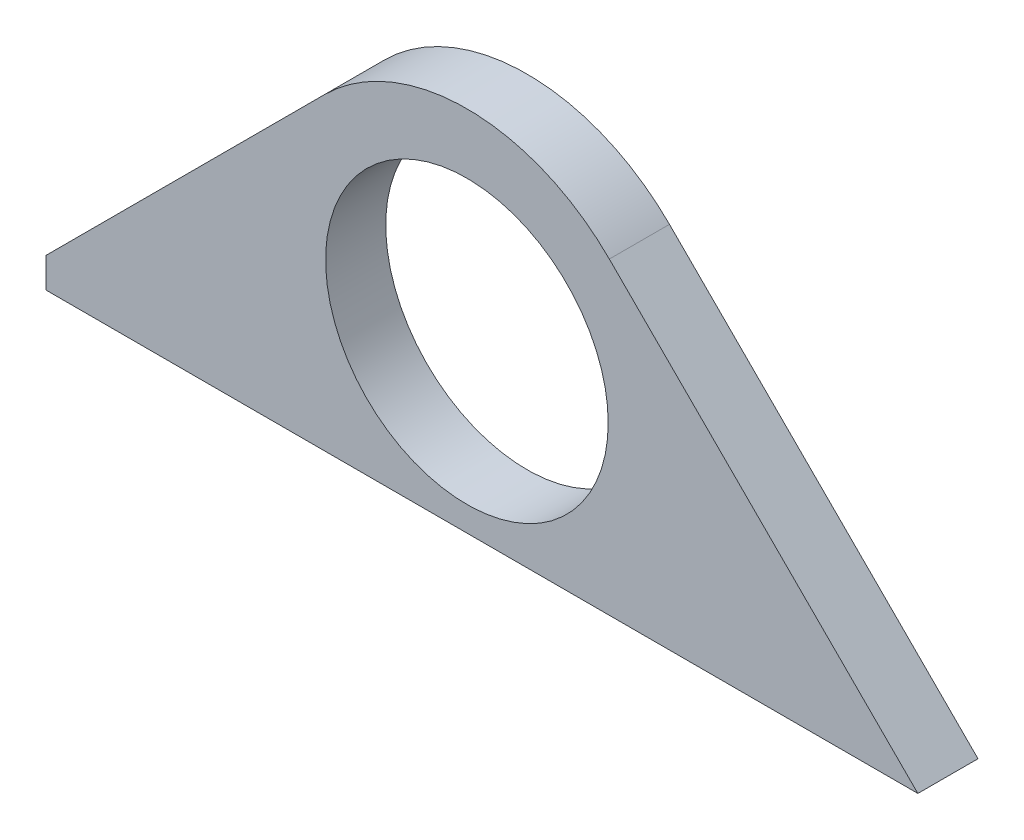
ISO-10303-21;
HEADER;
FILE_DESCRIPTION(('STEP AP214'),'2;1');
FILE_NAME('part.step','',(''),(''),'','','');
FILE_SCHEMA(('AUTOMOTIVE_DESIGN { 1 0 10303 214 1 1 1 1 }'));
ENDSEC;
DATA;
#1=APPLICATION_CONTEXT('core data for automotive mechanical design processes');
#2=APPLICATION_PROTOCOL_DEFINITION('international standard','automotive_design',2000,#1);
#3=PRODUCT_CONTEXT('',#1,'mechanical');
#4=PRODUCT('Part','Part','',(#3));
#5=PRODUCT_RELATED_PRODUCT_CATEGORY('part','',(#4));
#6=PRODUCT_DEFINITION_FORMATION('','',#4);
#7=PRODUCT_DEFINITION_CONTEXT('part definition',#1,'design');
#8=PRODUCT_DEFINITION('design','',#6,#7);
#9=PRODUCT_DEFINITION_SHAPE('','',#8);
#10=(LENGTH_UNIT() NAMED_UNIT(*) SI_UNIT(.MILLI.,.METRE.));
#11=(NAMED_UNIT(*) PLANE_ANGLE_UNIT() SI_UNIT($,.RADIAN.));
#12=(NAMED_UNIT(*) SI_UNIT($,.STERADIAN.) SOLID_ANGLE_UNIT());
#13=UNCERTAINTY_MEASURE_WITH_UNIT(LENGTH_MEASURE(1.E-05),#10,'distance_accuracy_value','');
#14=(GEOMETRIC_REPRESENTATION_CONTEXT(3) GLOBAL_UNCERTAINTY_ASSIGNED_CONTEXT((#13)) GLOBAL_UNIT_ASSIGNED_CONTEXT((#10,
#11,#12)) REPRESENTATION_CONTEXT('',''));
#15=CARTESIAN_POINT('',(0.,0.,0.));
#16=DIRECTION('',(0.,0.,1.));
#17=DIRECTION('',(1.,0.,0.));
#18=AXIS2_PLACEMENT_3D('',#15,#16,#17);
#19=CARTESIAN_POINT('',(69.9999999999995,27.6238456605013,10.));
#20=DIRECTION('',(0.,0.,-1.));
#21=DIRECTION('',(-1.,0.,0.));
#22=AXIS2_PLACEMENT_3D('',#19,#20,#21);
#23=PLANE('',#22);
#24=DIRECTION('',(0.,-1.,0.));
#25=VECTOR('',#24,1.);
#26=CARTESIAN_POINT('',(3.66564762091866E-13,4.99999999999979,10.));
#27=LINE('',#26,#25);
#28=CARTESIAN_POINT('',(3.66564762091866E-13,4.99999999999979,10.));
#29=VERTEX_POINT('',#28);
#30=CARTESIAN_POINT('',(0.,0.,10.));
#31=VERTEX_POINT('',#30);
#32=EDGE_CURVE('E117',#29,#31,#27,.T.);
#33=ORIENTED_EDGE('',*,*,#32,.T.);
#34=DIRECTION('',(1.,0.,0.));
#35=VECTOR('',#34,1.);
#36=CARTESIAN_POINT('',(0.,0.,10.));
#37=LINE('',#36,#35);
#38=CARTESIAN_POINT('',(145.,0.,10.));
#39=VERTEX_POINT('',#38);
#40=EDGE_CURVE('E84',#31,#39,#37,.T.);
#41=ORIENTED_EDGE('',*,*,#40,.T.);
#42=DIRECTION('',(-0.707106781186552,0.707106781186543,0.));
#43=VECTOR('',#42,1.);
#44=CARTESIAN_POINT('',(145.,0.,10.));
#45=LINE('',#44,#43);
#46=CARTESIAN_POINT('',(93.6880771697487,51.3119228302508,10.));
#47=VERTEX_POINT('',#46);
#48=EDGE_CURVE('E88',#39,#47,#45,.T.);
#49=ORIENTED_EDGE('',*,*,#48,.T.);
#50=CARTESIAN_POINT('',(69.9999999999995,27.6238456605013,10.));
#51=DIRECTION('',(0.,0.,1.));
#52=DIRECTION('',(-1.,0.,0.));
#53=AXIS2_PLACEMENT_3D('',#50,#51,#52);
#54=CIRCLE('',#53,33.5);
#55=CARTESIAN_POINT('',(46.31192283025,51.3119228302505,10.));
#56=VERTEX_POINT('',#55);
#57=EDGE_CURVE('E92',#47,#56,#54,.T.);
#58=ORIENTED_EDGE('',*,*,#57,.T.);
#59=DIRECTION('',(-0.707106781186539,-0.707106781186556,0.));
#60=VECTOR('',#59,1.);
#61=CARTESIAN_POINT('',(46.31192283025,51.3119228302505,10.));
#62=LINE('',#61,#60);
#63=EDGE_CURVE('E50',#56,#29,#62,.T.);
#64=ORIENTED_EDGE('',*,*,#63,.T.);
#65=EDGE_LOOP('',(#33,#41,#49,#58,#64));
#66=FACE_BOUND('',#65,.T.);
#67=CARTESIAN_POINT('',(69.9999999999995,27.6238456605013,10.));
#68=DIRECTION('',(0.,0.,1.));
#69=DIRECTION('',(1.,0.,0.));
#70=AXIS2_PLACEMENT_3D('',#67,#68,#69);
#71=CIRCLE('',#70,23.5);
#72=CARTESIAN_POINT('',(93.4999999999995,27.6238456605013,10.));
#73=VERTEX_POINT('',#72);
#74=EDGE_CURVE('E111',#73,#73,#71,.T.);
#75=ORIENTED_EDGE('',*,*,#74,.F.);
#76=EDGE_LOOP('',(#75));
#77=FACE_BOUND('',#76,.T.);
#78=ADVANCED_FACE('F33',(#66,#77),#23,.F.);
#79=CARTESIAN_POINT('',(69.9999999999995,27.6238456605013,0.));
#80=DIRECTION('',(0.,0.,-1.));
#81=DIRECTION('',(-1.,0.,0.));
#82=AXIS2_PLACEMENT_3D('',#79,#80,#81);
#83=PLANE('',#82);
#84=DIRECTION('',(0.,-1.,0.));
#85=VECTOR('',#84,1.);
#86=CARTESIAN_POINT('',(3.66564762091866E-13,4.99999999999979,0.));
#87=LINE('',#86,#85);
#88=CARTESIAN_POINT('',(3.66564762091866E-13,4.99999999999979,0.));
#89=VERTEX_POINT('',#88);
#90=CARTESIAN_POINT('',(0.,0.,0.));
#91=VERTEX_POINT('',#90);
#92=EDGE_CURVE('E107',#89,#91,#87,.T.);
#93=ORIENTED_EDGE('',*,*,#92,.F.);
#94=DIRECTION('',(-0.707106781186539,-0.707106781186556,0.));
#95=VECTOR('',#94,1.);
#96=CARTESIAN_POINT('',(46.31192283025,51.3119228302505,0.));
#97=LINE('',#96,#95);
#98=CARTESIAN_POINT('',(46.31192283025,51.3119228302505,0.));
#99=VERTEX_POINT('',#98);
#100=EDGE_CURVE('E76',#99,#89,#97,.T.);
#101=ORIENTED_EDGE('',*,*,#100,.F.);
#102=CARTESIAN_POINT('',(69.9999999999995,27.6238456605013,0.));
#103=DIRECTION('',(0.,0.,1.));
#104=DIRECTION('',(-1.,0.,0.));
#105=AXIS2_PLACEMENT_3D('',#102,#103,#104);
#106=CIRCLE('',#105,33.5);
#107=CARTESIAN_POINT('',(93.6880771697487,51.3119228302508,0.));
#108=VERTEX_POINT('',#107);
#109=EDGE_CURVE('E70',#108,#99,#106,.T.);
#110=ORIENTED_EDGE('',*,*,#109,.F.);
#111=DIRECTION('',(-0.707106781186551,0.707106781186544,0.));
#112=VECTOR('',#111,1.);
#113=CARTESIAN_POINT('',(140.,5.,0.));
#114=LINE('',#113,#112);
#115=CARTESIAN_POINT('',(145.,0.,0.));
#116=VERTEX_POINT('',#115);
#117=EDGE_CURVE('E98',#116,#108,#114,.T.);
#118=ORIENTED_EDGE('',*,*,#117,.F.);
#119=DIRECTION('',(1.,0.,0.));
#120=VECTOR('',#119,1.);
#121=CARTESIAN_POINT('',(140.,0.,0.));
#122=LINE('',#121,#120);
#123=EDGE_CURVE('E110',#91,#116,#122,.T.);
#124=ORIENTED_EDGE('',*,*,#123,.F.);
#125=EDGE_LOOP('',(#93,#101,#110,#118,#124));
#126=FACE_BOUND('',#125,.T.);
#127=CARTESIAN_POINT('',(69.9999999999995,27.6238456605013,0.));
#128=DIRECTION('',(0.,0.,1.));
#129=DIRECTION('',(1.,0.,0.));
#130=AXIS2_PLACEMENT_3D('',#127,#128,#129);
#131=CIRCLE('',#130,23.5);
#132=CARTESIAN_POINT('',(93.4999999999995,27.6238456605013,0.));
#133=VERTEX_POINT('',#132);
#134=EDGE_CURVE('E203',#133,#133,#131,.T.);
#135=ORIENTED_EDGE('',*,*,#134,.T.);
#136=EDGE_LOOP('',(#135));
#137=FACE_BOUND('',#136,.T.);
#138=ADVANCED_FACE('F123',(#126,#137),#83,.T.);
#139=CARTESIAN_POINT('',(3.66564762091866E-13,4.99999999999979,10.));
#140=DIRECTION('',(1.,0.,0.));
#141=DIRECTION('',(0.,1.,0.));
#142=AXIS2_PLACEMENT_3D('',#139,#140,#141);
#143=PLANE('',#142);
#144=ORIENTED_EDGE('',*,*,#92,.T.);
#145=DIRECTION('',(0.,0.,-1.));
#146=VECTOR('',#145,1.);
#147=CARTESIAN_POINT('',(0.,0.,10.));
#148=LINE('',#147,#146);
#149=EDGE_CURVE('E11',#31,#91,#148,.T.);
#150=ORIENTED_EDGE('',*,*,#149,.F.);
#151=ORIENTED_EDGE('',*,*,#32,.F.);
#152=DIRECTION('',(0.,0.,-1.));
#153=VECTOR('',#152,1.);
#154=CARTESIAN_POINT('',(3.66564762091866E-13,4.99999999999979,10.));
#155=LINE('',#154,#153);
#156=EDGE_CURVE('E103',#29,#89,#155,.T.);
#157=ORIENTED_EDGE('',*,*,#156,.T.);
#158=EDGE_LOOP('',(#144,#150,#151,#157));
#159=FACE_BOUND('',#158,.T.);
#160=ADVANCED_FACE('F35',(#159),#143,.F.);
#161=CARTESIAN_POINT('',(140.,0.,10.));
#162=DIRECTION('',(0.,1.,0.));
#163=DIRECTION('',(0.,0.,1.));
#164=AXIS2_PLACEMENT_3D('',#161,#162,#163);
#165=PLANE('',#164);
#166=ORIENTED_EDGE('',*,*,#123,.T.);
#167=DIRECTION('',(0.,0.,-1.));
#168=VECTOR('',#167,1.);
#169=CARTESIAN_POINT('',(145.,0.,10.));
#170=LINE('',#169,#168);
#171=EDGE_CURVE('E42',#39,#116,#170,.T.);
#172=ORIENTED_EDGE('',*,*,#171,.F.);
#173=ORIENTED_EDGE('',*,*,#40,.F.);
#174=ORIENTED_EDGE('',*,*,#149,.T.);
#175=EDGE_LOOP('',(#166,#172,#173,#174));
#176=FACE_BOUND('',#175,.T.);
#177=ADVANCED_FACE('F119',(#176),#165,.F.);
#178=CARTESIAN_POINT('',(140.,5.,10.));
#179=DIRECTION('',(-0.707106781186544,-0.707106781186551,0.));
#180=DIRECTION('',(0.707106781186551,-0.707106781186544,0.));
#181=AXIS2_PLACEMENT_3D('',#178,#179,#180);
#182=PLANE('',#181);
#183=ORIENTED_EDGE('',*,*,#117,.T.);
#184=DIRECTION('',(0.,0.,-1.));
#185=VECTOR('',#184,1.);
#186=CARTESIAN_POINT('',(93.6880771697487,51.3119228302508,10.));
#187=LINE('',#186,#185);
#188=EDGE_CURVE('E96',#47,#108,#187,.T.);
#189=ORIENTED_EDGE('',*,*,#188,.F.);
#190=ORIENTED_EDGE('',*,*,#48,.F.);
#191=ORIENTED_EDGE('',*,*,#171,.T.);
#192=EDGE_LOOP('',(#183,#189,#190,#191));
#193=FACE_BOUND('',#192,.T.);
#194=ADVANCED_FACE('F97',(#193),#182,.F.);
#195=CARTESIAN_POINT('',(69.9999999999995,27.6238456605013,10.));
#196=DIRECTION('',(0.,0.,-1.));
#197=DIRECTION('',(-1.,0.,0.));
#198=AXIS2_PLACEMENT_3D('',#195,#196,#197);
#199=CYLINDRICAL_SURFACE('',#198,33.5);
#200=ORIENTED_EDGE('',*,*,#109,.T.);
#201=DIRECTION('',(0.,0.,-1.));
#202=VECTOR('',#201,1.);
#203=CARTESIAN_POINT('',(46.31192283025,51.3119228302505,10.));
#204=LINE('',#203,#202);
#205=EDGE_CURVE('E99',#56,#99,#204,.T.);
#206=ORIENTED_EDGE('',*,*,#205,.F.);
#207=ORIENTED_EDGE('',*,*,#57,.F.);
#208=ORIENTED_EDGE('',*,*,#188,.T.);
#209=EDGE_LOOP('',(#200,#206,#207,#208));
#210=FACE_BOUND('',#209,.T.);
#211=ADVANCED_FACE('F101',(#210),#199,.T.);
#212=CARTESIAN_POINT('',(46.31192283025,51.3119228302505,10.));
#213=DIRECTION('',(0.707106781186556,-0.707106781186539,0.));
#214=DIRECTION('',(0.707106781186539,0.707106781186556,0.));
#215=AXIS2_PLACEMENT_3D('',#212,#213,#214);
#216=PLANE('',#215);
#217=ORIENTED_EDGE('',*,*,#100,.T.);
#218=ORIENTED_EDGE('',*,*,#156,.F.);
#219=ORIENTED_EDGE('',*,*,#63,.F.);
#220=ORIENTED_EDGE('',*,*,#205,.T.);
#221=EDGE_LOOP('',(#217,#218,#219,#220));
#222=FACE_BOUND('',#221,.T.);
#223=ADVANCED_FACE('F127',(#222),#216,.F.);
#224=CARTESIAN_POINT('',(69.9999999999995,27.6238456605013,10.));
#225=DIRECTION('',(0.,0.,-1.));
#226=DIRECTION('',(-1.,0.,0.));
#227=AXIS2_PLACEMENT_3D('',#224,#225,#226);
#228=CYLINDRICAL_SURFACE('',#227,23.5);
#229=ORIENTED_EDGE('',*,*,#74,.T.);
#230=EDGE_LOOP('',(#229));
#231=FACE_BOUND('',#230,.T.);
#232=ORIENTED_EDGE('',*,*,#134,.F.);
#233=EDGE_LOOP('',(#232));
#234=FACE_BOUND('',#233,.T.);
#235=ADVANCED_FACE('F129',(#231,#234),#228,.F.);
#236=CLOSED_SHELL('',(#78,#138,#160,#177,#194,#211,#223,#235));
#237=MANIFOLD_SOLID_BREP('B2',#236);
#238=ADVANCED_BREP_SHAPE_REPRESENTATION('',(#18,#237),#14);
#239=SHAPE_DEFINITION_REPRESENTATION(#9,#238);
ENDSEC;
END-ISO-10303-21;
